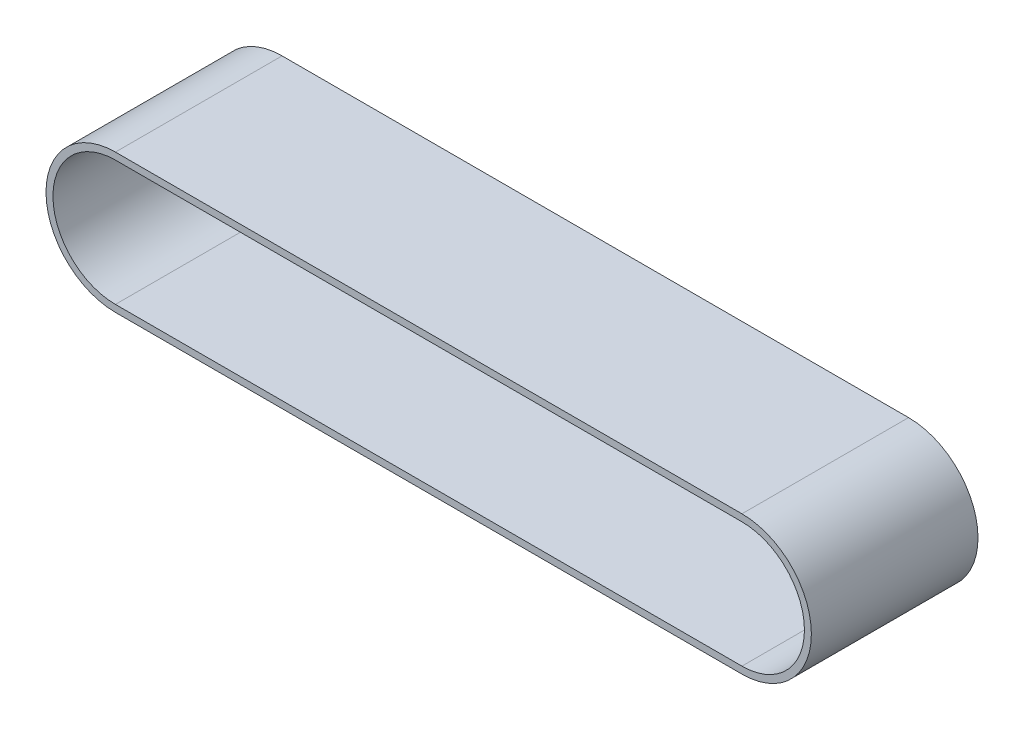
ISO-10303-21;
HEADER;
FILE_DESCRIPTION(('STEP AP214'),'2;1');
FILE_NAME('part.step','',(''),(''),'','','');
FILE_SCHEMA(('AUTOMOTIVE_DESIGN { 1 0 10303 214 1 1 1 1 }'));
ENDSEC;
DATA;
#1=APPLICATION_CONTEXT('core data for automotive mechanical design processes');
#2=APPLICATION_PROTOCOL_DEFINITION('international standard','automotive_design',2000,#1);
#3=PRODUCT_CONTEXT('',#1,'mechanical');
#4=PRODUCT('Part','Part','',(#3));
#5=PRODUCT_RELATED_PRODUCT_CATEGORY('part','',(#4));
#6=PRODUCT_DEFINITION_FORMATION('','',#4);
#7=PRODUCT_DEFINITION_CONTEXT('part definition',#1,'design');
#8=PRODUCT_DEFINITION('design','',#6,#7);
#9=PRODUCT_DEFINITION_SHAPE('','',#8);
#10=(LENGTH_UNIT() NAMED_UNIT(*) SI_UNIT(.MILLI.,.METRE.));
#11=(NAMED_UNIT(*) PLANE_ANGLE_UNIT() SI_UNIT($,.RADIAN.));
#12=(NAMED_UNIT(*) SI_UNIT($,.STERADIAN.) SOLID_ANGLE_UNIT());
#13=UNCERTAINTY_MEASURE_WITH_UNIT(LENGTH_MEASURE(1.E-05),#10,'distance_accuracy_value','');
#14=(GEOMETRIC_REPRESENTATION_CONTEXT(3) GLOBAL_UNCERTAINTY_ASSIGNED_CONTEXT((#13)) GLOBAL_UNIT_ASSIGNED_CONTEXT((#10,
#11,#12)) REPRESENTATION_CONTEXT('',''));
#15=CARTESIAN_POINT('',(0.,0.,0.));
#16=DIRECTION('',(0.,0.,1.));
#17=DIRECTION('',(1.,0.,0.));
#18=AXIS2_PLACEMENT_3D('',#15,#16,#17);
#19=CARTESIAN_POINT('',(-286.5,0.,152.4));
#20=DIRECTION('',(0.,0.,1.));
#21=DIRECTION('',(1.,0.,0.));
#22=AXIS2_PLACEMENT_3D('',#19,#20,#21);
#23=PLANE('',#22);
#24=CARTESIAN_POINT('',(-286.5,0.,152.4));
#25=DIRECTION('',(0.,0.,1.));
#26=DIRECTION('',(1.,0.,0.));
#27=AXIS2_PLACEMENT_3D('',#24,#25,#26);
#28=CIRCLE('',#27,63.5);
#29=CARTESIAN_POINT('',(-286.5,63.5,152.4));
#30=VERTEX_POINT('',#29);
#31=CARTESIAN_POINT('',(-286.5,-63.5,152.4));
#32=VERTEX_POINT('',#31);
#33=EDGE_CURVE('E155',#30,#32,#28,.T.);
#34=ORIENTED_EDGE('',*,*,#33,.T.);
#35=DIRECTION('',(1.,0.,0.));
#36=VECTOR('',#35,1.);
#37=CARTESIAN_POINT('',(-286.5,-63.5,152.4));
#38=LINE('',#37,#36);
#39=CARTESIAN_POINT('',(286.5,-63.5,152.4));
#40=VERTEX_POINT('',#39);
#41=EDGE_CURVE('E159',#32,#40,#38,.T.);
#42=ORIENTED_EDGE('',*,*,#41,.T.);
#43=CARTESIAN_POINT('',(286.5,0.,152.4));
#44=DIRECTION('',(0.,0.,1.));
#45=DIRECTION('',(1.,0.,0.));
#46=AXIS2_PLACEMENT_3D('',#43,#44,#45);
#47=CIRCLE('',#46,63.5);
#48=CARTESIAN_POINT('',(286.5,63.5,152.4));
#49=VERTEX_POINT('',#48);
#50=EDGE_CURVE('E163',#40,#49,#47,.T.);
#51=ORIENTED_EDGE('',*,*,#50,.T.);
#52=DIRECTION('',(-1.,0.,0.));
#53=VECTOR('',#52,1.);
#54=CARTESIAN_POINT('',(-286.5,63.5,152.4));
#55=LINE('',#54,#53);
#56=EDGE_CURVE('E166',#49,#30,#55,.T.);
#57=ORIENTED_EDGE('',*,*,#56,.T.);
#58=EDGE_LOOP('',(#34,#42,#51,#57));
#59=FACE_BOUND('',#58,.T.);
#60=DIRECTION('',(1.,0.,0.));
#61=VECTOR('',#60,1.);
#62=CARTESIAN_POINT('',(-286.5,-57.15,152.4));
#63=LINE('',#62,#61);
#64=CARTESIAN_POINT('',(-286.5,-57.15,152.4));
#65=VERTEX_POINT('',#64);
#66=CARTESIAN_POINT('',(286.5,-57.15,152.4));
#67=VERTEX_POINT('',#66);
#68=EDGE_CURVE('E116',#65,#67,#63,.T.);
#69=ORIENTED_EDGE('',*,*,#68,.F.);
#70=CARTESIAN_POINT('',(-286.5,0.,152.4));
#71=DIRECTION('',(0.,0.,1.));
#72=DIRECTION('',(1.,0.,0.));
#73=AXIS2_PLACEMENT_3D('',#70,#71,#72);
#74=CIRCLE('',#73,57.15);
#75=CARTESIAN_POINT('',(-286.5,57.15,152.4));
#76=VERTEX_POINT('',#75);
#77=EDGE_CURVE('E107',#76,#65,#74,.T.);
#78=ORIENTED_EDGE('',*,*,#77,.F.);
#79=DIRECTION('',(-1.,0.,0.));
#80=VECTOR('',#79,1.);
#81=CARTESIAN_POINT('',(-286.5,57.15,152.4));
#82=LINE('',#81,#80);
#83=CARTESIAN_POINT('',(286.5,57.15,152.4));
#84=VERTEX_POINT('',#83);
#85=EDGE_CURVE('E133',#84,#76,#82,.T.);
#86=ORIENTED_EDGE('',*,*,#85,.F.);
#87=CARTESIAN_POINT('',(286.5,0.,152.4));
#88=DIRECTION('',(0.,0.,1.));
#89=DIRECTION('',(1.,0.,0.));
#90=AXIS2_PLACEMENT_3D('',#87,#88,#89);
#91=CIRCLE('',#90,57.15);
#92=EDGE_CURVE('E129',#67,#84,#91,.T.);
#93=ORIENTED_EDGE('',*,*,#92,.F.);
#94=EDGE_LOOP('',(#69,#78,#86,#93));
#95=FACE_BOUND('',#94,.T.);
#96=ADVANCED_FACE('F41',(#59,#95),#23,.T.);
#97=CARTESIAN_POINT('',(-286.5,0.,0.));
#98=DIRECTION('',(0.,0.,1.));
#99=DIRECTION('',(1.,0.,0.));
#100=AXIS2_PLACEMENT_3D('',#97,#98,#99);
#101=PLANE('',#100);
#102=CARTESIAN_POINT('',(-286.5,0.,0.));
#103=DIRECTION('',(0.,0.,1.));
#104=DIRECTION('',(1.,0.,0.));
#105=AXIS2_PLACEMENT_3D('',#102,#103,#104);
#106=CIRCLE('',#105,63.5);
#107=CARTESIAN_POINT('',(-286.5,63.5,0.));
#108=VERTEX_POINT('',#107);
#109=CARTESIAN_POINT('',(-286.5,-63.5,0.));
#110=VERTEX_POINT('',#109);
#111=EDGE_CURVE('E125',#108,#110,#106,.T.);
#112=ORIENTED_EDGE('',*,*,#111,.F.);
#113=DIRECTION('',(-1.,0.,0.));
#114=VECTOR('',#113,1.);
#115=CARTESIAN_POINT('',(-286.5,63.5,0.));
#116=LINE('',#115,#114);
#117=CARTESIAN_POINT('',(286.5,63.5,0.));
#118=VERTEX_POINT('',#117);
#119=EDGE_CURVE('E160',#118,#108,#116,.T.);
#120=ORIENTED_EDGE('',*,*,#119,.F.);
#121=CARTESIAN_POINT('',(286.5,0.,0.));
#122=DIRECTION('',(0.,0.,1.));
#123=DIRECTION('',(1.,0.,0.));
#124=AXIS2_PLACEMENT_3D('',#121,#122,#123);
#125=CIRCLE('',#124,63.5);
#126=CARTESIAN_POINT('',(286.5,-63.5,0.));
#127=VERTEX_POINT('',#126);
#128=EDGE_CURVE('E176',#127,#118,#125,.T.);
#129=ORIENTED_EDGE('',*,*,#128,.F.);
#130=DIRECTION('',(1.,0.,0.));
#131=VECTOR('',#130,1.);
#132=CARTESIAN_POINT('',(-286.5,-63.5,0.));
#133=LINE('',#132,#131);
#134=EDGE_CURVE('E173',#110,#127,#133,.T.);
#135=ORIENTED_EDGE('',*,*,#134,.F.);
#136=EDGE_LOOP('',(#112,#120,#129,#135));
#137=FACE_BOUND('',#136,.T.);
#138=CARTESIAN_POINT('',(-286.5,0.,0.));
#139=DIRECTION('',(0.,0.,1.));
#140=DIRECTION('',(1.,0.,0.));
#141=AXIS2_PLACEMENT_3D('',#138,#139,#140);
#142=CIRCLE('',#141,57.15);
#143=CARTESIAN_POINT('',(-286.5,57.15,0.));
#144=VERTEX_POINT('',#143);
#145=CARTESIAN_POINT('',(-286.5,-57.15,0.));
#146=VERTEX_POINT('',#145);
#147=EDGE_CURVE('E65',#144,#146,#142,.T.);
#148=ORIENTED_EDGE('',*,*,#147,.T.);
#149=DIRECTION('',(1.,0.,0.));
#150=VECTOR('',#149,1.);
#151=CARTESIAN_POINT('',(-286.5,-57.15,0.));
#152=LINE('',#151,#150);
#153=CARTESIAN_POINT('',(286.5,-57.15,0.));
#154=VERTEX_POINT('',#153);
#155=EDGE_CURVE('E123',#146,#154,#152,.T.);
#156=ORIENTED_EDGE('',*,*,#155,.T.);
#157=CARTESIAN_POINT('',(286.5,0.,0.));
#158=DIRECTION('',(0.,0.,1.));
#159=DIRECTION('',(1.,0.,0.));
#160=AXIS2_PLACEMENT_3D('',#157,#158,#159);
#161=CIRCLE('',#160,57.15);
#162=CARTESIAN_POINT('',(286.5,57.15,0.));
#163=VERTEX_POINT('',#162);
#164=EDGE_CURVE('E142',#154,#163,#161,.T.);
#165=ORIENTED_EDGE('',*,*,#164,.T.);
#166=DIRECTION('',(-1.,0.,0.));
#167=VECTOR('',#166,1.);
#168=CARTESIAN_POINT('',(-286.5,57.15,0.));
#169=LINE('',#168,#167);
#170=EDGE_CURVE('E117',#163,#144,#169,.T.);
#171=ORIENTED_EDGE('',*,*,#170,.T.);
#172=EDGE_LOOP('',(#148,#156,#165,#171));
#173=FACE_BOUND('',#172,.T.);
#174=ADVANCED_FACE('F199',(#137,#173),#101,.F.);
#175=CARTESIAN_POINT('',(-286.5,0.,152.4));
#176=DIRECTION('',(0.,0.,-1.));
#177=DIRECTION('',(-1.,0.,0.));
#178=AXIS2_PLACEMENT_3D('',#175,#176,#177);
#179=CYLINDRICAL_SURFACE('',#178,63.5);
#180=ORIENTED_EDGE('',*,*,#111,.T.);
#181=DIRECTION('',(0.,0.,-1.));
#182=VECTOR('',#181,1.);
#183=CARTESIAN_POINT('',(-286.5,-63.5,152.4));
#184=LINE('',#183,#182);
#185=EDGE_CURVE('E11',#32,#110,#184,.T.);
#186=ORIENTED_EDGE('',*,*,#185,.F.);
#187=ORIENTED_EDGE('',*,*,#33,.F.);
#188=DIRECTION('',(0.,0.,-1.));
#189=VECTOR('',#188,1.);
#190=CARTESIAN_POINT('',(-286.5,63.5,152.4));
#191=LINE('',#190,#189);
#192=EDGE_CURVE('E169',#30,#108,#191,.T.);
#193=ORIENTED_EDGE('',*,*,#192,.T.);
#194=EDGE_LOOP('',(#180,#186,#187,#193));
#195=FACE_BOUND('',#194,.T.);
#196=ADVANCED_FACE('F43',(#195),#179,.T.);
#197=CARTESIAN_POINT('',(-286.5,-63.5,152.4));
#198=DIRECTION('',(0.,1.,0.));
#199=DIRECTION('',(0.,0.,1.));
#200=AXIS2_PLACEMENT_3D('',#197,#198,#199);
#201=PLANE('',#200);
#202=ORIENTED_EDGE('',*,*,#134,.T.);
#203=DIRECTION('',(0.,0.,-1.));
#204=VECTOR('',#203,1.);
#205=CARTESIAN_POINT('',(286.5,-63.5,152.4));
#206=LINE('',#205,#204);
#207=EDGE_CURVE('E50',#40,#127,#206,.T.);
#208=ORIENTED_EDGE('',*,*,#207,.F.);
#209=ORIENTED_EDGE('',*,*,#41,.F.);
#210=ORIENTED_EDGE('',*,*,#185,.T.);
#211=EDGE_LOOP('',(#202,#208,#209,#210));
#212=FACE_BOUND('',#211,.T.);
#213=ADVANCED_FACE('F209',(#212),#201,.F.);
#214=CARTESIAN_POINT('',(286.5,0.,152.4));
#215=DIRECTION('',(0.,0.,-1.));
#216=DIRECTION('',(-1.,0.,0.));
#217=AXIS2_PLACEMENT_3D('',#214,#215,#216);
#218=CYLINDRICAL_SURFACE('',#217,63.5);
#219=ORIENTED_EDGE('',*,*,#128,.T.);
#220=DIRECTION('',(0.,0.,-1.));
#221=VECTOR('',#220,1.);
#222=CARTESIAN_POINT('',(286.5,63.5,152.4));
#223=LINE('',#222,#221);
#224=EDGE_CURVE('E184',#49,#118,#223,.T.);
#225=ORIENTED_EDGE('',*,*,#224,.F.);
#226=ORIENTED_EDGE('',*,*,#50,.F.);
#227=ORIENTED_EDGE('',*,*,#207,.T.);
#228=EDGE_LOOP('',(#219,#225,#226,#227));
#229=FACE_BOUND('',#228,.T.);
#230=ADVANCED_FACE('F193',(#229),#218,.T.);
#231=CARTESIAN_POINT('',(-286.5,63.5,152.4));
#232=DIRECTION('',(0.,-1.,0.));
#233=DIRECTION('',(0.,0.,-1.));
#234=AXIS2_PLACEMENT_3D('',#231,#232,#233);
#235=PLANE('',#234);
#236=ORIENTED_EDGE('',*,*,#119,.T.);
#237=ORIENTED_EDGE('',*,*,#192,.F.);
#238=ORIENTED_EDGE('',*,*,#56,.F.);
#239=ORIENTED_EDGE('',*,*,#224,.T.);
#240=EDGE_LOOP('',(#236,#237,#238,#239));
#241=FACE_BOUND('',#240,.T.);
#242=ADVANCED_FACE('F203',(#241),#235,.F.);
#243=CARTESIAN_POINT('',(-286.5,0.,152.4));
#244=DIRECTION('',(0.,0.,-1.));
#245=DIRECTION('',(-1.,0.,0.));
#246=AXIS2_PLACEMENT_3D('',#243,#244,#245);
#247=CYLINDRICAL_SURFACE('',#246,57.15);
#248=ORIENTED_EDGE('',*,*,#147,.F.);
#249=DIRECTION('',(0.,0.,-1.));
#250=VECTOR('',#249,1.);
#251=CARTESIAN_POINT('',(-286.5,57.15,152.4));
#252=LINE('',#251,#250);
#253=EDGE_CURVE('E111',#76,#144,#252,.T.);
#254=ORIENTED_EDGE('',*,*,#253,.F.);
#255=ORIENTED_EDGE('',*,*,#77,.T.);
#256=DIRECTION('',(0.,0.,-1.));
#257=VECTOR('',#256,1.);
#258=CARTESIAN_POINT('',(-286.5,-57.15,152.4));
#259=LINE('',#258,#257);
#260=EDGE_CURVE('E110',#65,#146,#259,.T.);
#261=ORIENTED_EDGE('',*,*,#260,.T.);
#262=EDGE_LOOP('',(#248,#254,#255,#261));
#263=FACE_BOUND('',#262,.T.);
#264=ADVANCED_FACE('F109',(#263),#247,.F.);
#265=CARTESIAN_POINT('',(-286.5,-57.15,152.4));
#266=DIRECTION('',(0.,1.,0.));
#267=DIRECTION('',(0.,0.,1.));
#268=AXIS2_PLACEMENT_3D('',#265,#266,#267);
#269=PLANE('',#268);
#270=ORIENTED_EDGE('',*,*,#155,.F.);
#271=ORIENTED_EDGE('',*,*,#260,.F.);
#272=ORIENTED_EDGE('',*,*,#68,.T.);
#273=DIRECTION('',(0.,0.,-1.));
#274=VECTOR('',#273,1.);
#275=CARTESIAN_POINT('',(286.5,-57.15,152.4));
#276=LINE('',#275,#274);
#277=EDGE_CURVE('E126',#67,#154,#276,.T.);
#278=ORIENTED_EDGE('',*,*,#277,.T.);
#279=EDGE_LOOP('',(#270,#271,#272,#278));
#280=FACE_BOUND('',#279,.T.);
#281=ADVANCED_FACE('F120',(#280),#269,.T.);
#282=CARTESIAN_POINT('',(286.5,0.,152.4));
#283=DIRECTION('',(0.,0.,-1.));
#284=DIRECTION('',(-1.,0.,0.));
#285=AXIS2_PLACEMENT_3D('',#282,#283,#284);
#286=CYLINDRICAL_SURFACE('',#285,57.15);
#287=ORIENTED_EDGE('',*,*,#164,.F.);
#288=ORIENTED_EDGE('',*,*,#277,.F.);
#289=ORIENTED_EDGE('',*,*,#92,.T.);
#290=DIRECTION('',(0.,0.,-1.));
#291=VECTOR('',#290,1.);
#292=CARTESIAN_POINT('',(286.5,57.15,152.4));
#293=LINE('',#292,#291);
#294=EDGE_CURVE('E57',#84,#163,#293,.T.);
#295=ORIENTED_EDGE('',*,*,#294,.T.);
#296=EDGE_LOOP('',(#287,#288,#289,#295));
#297=FACE_BOUND('',#296,.T.);
#298=ADVANCED_FACE('F232',(#297),#286,.F.);
#299=CARTESIAN_POINT('',(-286.5,57.15,152.4));
#300=DIRECTION('',(0.,-1.,0.));
#301=DIRECTION('',(0.,0.,-1.));
#302=AXIS2_PLACEMENT_3D('',#299,#300,#301);
#303=PLANE('',#302);
#304=ORIENTED_EDGE('',*,*,#170,.F.);
#305=ORIENTED_EDGE('',*,*,#294,.F.);
#306=ORIENTED_EDGE('',*,*,#85,.T.);
#307=ORIENTED_EDGE('',*,*,#253,.T.);
#308=EDGE_LOOP('',(#304,#305,#306,#307));
#309=FACE_BOUND('',#308,.T.);
#310=ADVANCED_FACE('F236',(#309),#303,.T.);
#311=CLOSED_SHELL('',(#96,#174,#196,#213,#230,#242,#264,#281,#298,#310));
#312=MANIFOLD_SOLID_BREP('B2',#311);
#313=ADVANCED_BREP_SHAPE_REPRESENTATION('',(#18,#312),#14);
#314=SHAPE_DEFINITION_REPRESENTATION(#9,#313);
ENDSEC;
END-ISO-10303-21;
